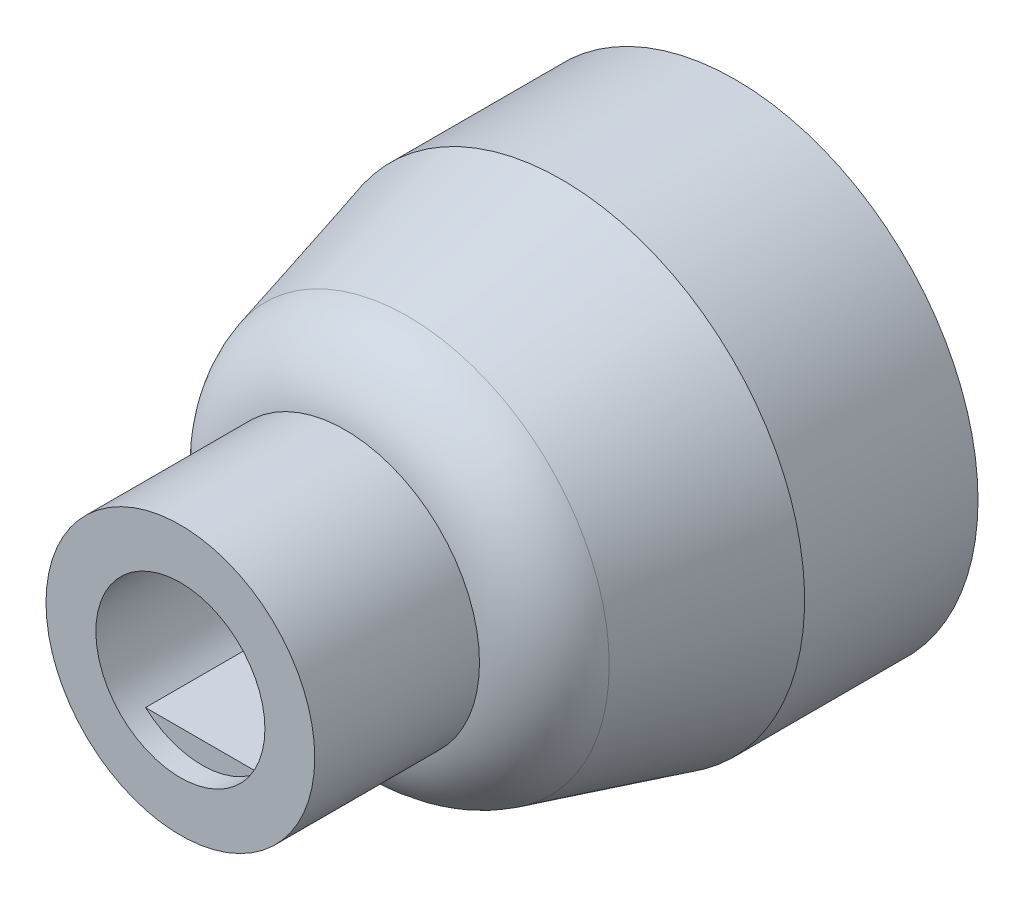
ISO-10303-21;
HEADER;
FILE_DESCRIPTION(('STEP AP214'),'2;1');
FILE_NAME('part.step','',(''),(''),'','','');
FILE_SCHEMA(('AUTOMOTIVE_DESIGN { 1 0 10303 214 1 1 1 1 }'));
ENDSEC;
DATA;
#1=APPLICATION_CONTEXT('core data for automotive mechanical design processes');
#2=APPLICATION_PROTOCOL_DEFINITION('international standard','automotive_design',2000,#1);
#3=PRODUCT_CONTEXT('',#1,'mechanical');
#4=PRODUCT('Part','Part','',(#3));
#5=PRODUCT_RELATED_PRODUCT_CATEGORY('part','',(#4));
#6=PRODUCT_DEFINITION_FORMATION('','',#4);
#7=PRODUCT_DEFINITION_CONTEXT('part definition',#1,'design');
#8=PRODUCT_DEFINITION('design','',#6,#7);
#9=PRODUCT_DEFINITION_SHAPE('','',#8);
#10=(LENGTH_UNIT() NAMED_UNIT(*) SI_UNIT(.MILLI.,.METRE.));
#11=(NAMED_UNIT(*) PLANE_ANGLE_UNIT() SI_UNIT($,.RADIAN.));
#12=(NAMED_UNIT(*) SI_UNIT($,.STERADIAN.) SOLID_ANGLE_UNIT());
#13=UNCERTAINTY_MEASURE_WITH_UNIT(LENGTH_MEASURE(1.E-05),#10,'distance_accuracy_value','');
#14=(GEOMETRIC_REPRESENTATION_CONTEXT(3) GLOBAL_UNCERTAINTY_ASSIGNED_CONTEXT((#13)) GLOBAL_UNIT_ASSIGNED_CONTEXT((#10,
#11,#12)) REPRESENTATION_CONTEXT('',''));
#15=CARTESIAN_POINT('',(0.,0.,0.));
#16=DIRECTION('',(0.,0.,1.));
#17=DIRECTION('',(1.,0.,0.));
#18=AXIS2_PLACEMENT_3D('',#15,#16,#17);
#19=CARTESIAN_POINT('',(-1.30384048104053,1.45,12.8));
#20=DIRECTION('',(0.,-1.,0.));
#21=DIRECTION('',(0.,0.,-1.));
#22=AXIS2_PLACEMENT_3D('',#19,#20,#21);
#23=PLANE('',#22);
#24=DIRECTION('',(0.,0.,-1.));
#25=VECTOR('',#24,1.);
#26=CARTESIAN_POINT('',(1.30384048104053,1.45,12.8));
#27=LINE('',#26,#25);
#28=CARTESIAN_POINT('',(1.30384048104053,1.45,12.3));
#29=VERTEX_POINT('',#28);
#30=CARTESIAN_POINT('',(1.30384048104053,1.45,9.));
#31=VERTEX_POINT('',#30);
#32=EDGE_CURVE('E90',#29,#31,#27,.T.);
#33=ORIENTED_EDGE('',*,*,#32,.F.);
#34=DIRECTION('',(-1.,0.,0.));
#35=VECTOR('',#34,1.);
#36=CARTESIAN_POINT('',(-1.30384048104053,1.45,12.3));
#37=LINE('',#36,#35);
#38=CARTESIAN_POINT('',(-1.30384048104053,1.45,12.3));
#39=VERTEX_POINT('',#38);
#40=EDGE_CURVE('E78',#29,#39,#37,.T.);
#41=ORIENTED_EDGE('',*,*,#40,.T.);
#42=DIRECTION('',(0.,0.,-1.));
#43=VECTOR('',#42,1.);
#44=CARTESIAN_POINT('',(-1.30384048104053,1.45,12.8));
#45=LINE('',#44,#43);
#46=CARTESIAN_POINT('',(-1.30384048104053,1.45,9.));
#47=VERTEX_POINT('',#46);
#48=EDGE_CURVE('E93',#39,#47,#45,.T.);
#49=ORIENTED_EDGE('',*,*,#48,.T.);
#50=DIRECTION('',(-1.,0.,0.));
#51=VECTOR('',#50,1.);
#52=CARTESIAN_POINT('',(-1.30384048104053,1.45,9.));
#53=LINE('',#52,#51);
#54=EDGE_CURVE('E98',#31,#47,#53,.T.);
#55=ORIENTED_EDGE('',*,*,#54,.F.);
#56=EDGE_LOOP('',(#33,#41,#49,#55));
#57=FACE_BOUND('',#56,.T.);
#58=ADVANCED_FACE('F39',(#57),#23,.T.);
#59=CARTESIAN_POINT('',(-1.30384048104053,-1.45,12.8));
#60=DIRECTION('',(0.,1.,0.));
#61=DIRECTION('',(0.,0.,1.));
#62=AXIS2_PLACEMENT_3D('',#59,#60,#61);
#63=PLANE('',#62);
#64=DIRECTION('',(0.,0.,-1.));
#65=VECTOR('',#64,1.);
#66=CARTESIAN_POINT('',(-1.30384048104053,-1.45,12.8));
#67=LINE('',#66,#65);
#68=CARTESIAN_POINT('',(-1.30384048104053,-1.45,12.3));
#69=VERTEX_POINT('',#68);
#70=CARTESIAN_POINT('',(-1.30384048104053,-1.45,9.));
#71=VERTEX_POINT('',#70);
#72=EDGE_CURVE('E107',#69,#71,#67,.T.);
#73=ORIENTED_EDGE('',*,*,#72,.F.);
#74=DIRECTION('',(1.,0.,0.));
#75=VECTOR('',#74,1.);
#76=CARTESIAN_POINT('',(-1.30384048104053,-1.45,12.3));
#77=LINE('',#76,#75);
#78=CARTESIAN_POINT('',(1.30384048104053,-1.45,12.3));
#79=VERTEX_POINT('',#78);
#80=EDGE_CURVE('E118',#69,#79,#77,.T.);
#81=ORIENTED_EDGE('',*,*,#80,.T.);
#82=DIRECTION('',(0.,0.,-1.));
#83=VECTOR('',#82,1.);
#84=CARTESIAN_POINT('',(1.30384048104053,-1.45,12.8));
#85=LINE('',#84,#83);
#86=CARTESIAN_POINT('',(1.30384048104053,-1.45,9.));
#87=VERTEX_POINT('',#86);
#88=EDGE_CURVE('E258',#79,#87,#85,.T.);
#89=ORIENTED_EDGE('',*,*,#88,.T.);
#90=DIRECTION('',(1.,0.,0.));
#91=VECTOR('',#90,1.);
#92=CARTESIAN_POINT('',(-1.30384048104053,-1.45,9.));
#93=LINE('',#92,#91);
#94=EDGE_CURVE('E244',#71,#87,#93,.T.);
#95=ORIENTED_EDGE('',*,*,#94,.F.);
#96=EDGE_LOOP('',(#73,#81,#89,#95));
#97=FACE_BOUND('',#96,.T.);
#98=ADVANCED_FACE('F139',(#97),#63,.T.);
#99=CARTESIAN_POINT('',(0.,0.,9.));
#100=DIRECTION('',(0.,0.,-1.));
#101=DIRECTION('',(-1.,0.,0.));
#102=AXIS2_PLACEMENT_3D('',#99,#100,#101);
#103=CYLINDRICAL_SURFACE('',#102,5.6);
#104=CARTESIAN_POINT('',(0.,0.,3.99999999999991));
#105=DIRECTION('',(0.,0.,1.));
#106=DIRECTION('',(1.,0.,0.));
#107=AXIS2_PLACEMENT_3D('',#104,#105,#106);
#108=CIRCLE('',#107,5.6);
#109=CARTESIAN_POINT('',(-5.6,0.,3.99999999999991));
#110=VERTEX_POINT('',#109);
#111=EDGE_CURVE('E48',#110,#110,#108,.F.);
#112=ORIENTED_EDGE('',*,*,#111,.T.);
#113=EDGE_LOOP('',(#112));
#114=FACE_BOUND('',#113,.T.);
#115=CARTESIAN_POINT('',(0.,0.,0.));
#116=DIRECTION('',(0.,0.,1.));
#117=DIRECTION('',(1.,0.,0.));
#118=AXIS2_PLACEMENT_3D('',#115,#116,#117);
#119=CIRCLE('',#118,5.6);
#120=CARTESIAN_POINT('',(5.6,0.,0.));
#121=VERTEX_POINT('',#120);
#122=EDGE_CURVE('E113',#121,#121,#119,.T.);
#123=ORIENTED_EDGE('',*,*,#122,.T.);
#124=EDGE_LOOP('',(#123));
#125=FACE_BOUND('',#124,.T.);
#126=ADVANCED_FACE('F124',(#114,#125),#103,.T.);
#127=CARTESIAN_POINT('',(0.,0.,0.));
#128=DIRECTION('',(0.,0.,1.));
#129=DIRECTION('',(1.,0.,0.));
#130=AXIS2_PLACEMENT_3D('',#127,#128,#129);
#131=PLANE('',#130);
#132=ORIENTED_EDGE('',*,*,#122,.F.);
#133=EDGE_LOOP('',(#132));
#134=FACE_BOUND('',#133,.T.);
#135=ADVANCED_FACE('F154',(#134),#131,.F.);
#136=CARTESIAN_POINT('',(0.,0.,12.8));
#137=DIRECTION('',(0.,0.,1.));
#138=DIRECTION('',(1.,0.,0.));
#139=AXIS2_PLACEMENT_3D('',#136,#137,#138);
#140=PLANE('',#139);
#141=CARTESIAN_POINT('',(0.,0.,12.8));
#142=DIRECTION('',(0.,0.,1.));
#143=DIRECTION('',(1.,0.,0.));
#144=AXIS2_PLACEMENT_3D('',#141,#142,#143);
#145=CIRCLE('',#144,1.95);
#146=CARTESIAN_POINT('',(1.95,0.,12.8));
#147=VERTEX_POINT('',#146);
#148=EDGE_CURVE('E252',#147,#147,#145,.T.);
#149=ORIENTED_EDGE('',*,*,#148,.F.);
#150=EDGE_LOOP('',(#149));
#151=FACE_BOUND('',#150,.T.);
#152=CARTESIAN_POINT('',(0.,0.,12.8));
#153=DIRECTION('',(0.,0.,1.));
#154=DIRECTION('',(1.,0.,0.));
#155=AXIS2_PLACEMENT_3D('',#152,#153,#154);
#156=CIRCLE('',#155,3.1);
#157=CARTESIAN_POINT('',(-3.1,0.,12.8));
#158=VERTEX_POINT('',#157);
#159=EDGE_CURVE('E105',#158,#158,#156,.T.);
#160=ORIENTED_EDGE('',*,*,#159,.T.);
#161=EDGE_LOOP('',(#160));
#162=FACE_BOUND('',#161,.T.);
#163=ADVANCED_FACE('F151',(#151,#162),#140,.T.);
#164=CARTESIAN_POINT('',(0.,0.,12.8));
#165=DIRECTION('',(0.,0.,-1.));
#166=DIRECTION('',(-1.,0.,0.));
#167=AXIS2_PLACEMENT_3D('',#164,#165,#166);
#168=CYLINDRICAL_SURFACE('',#167,3.1);
#169=CARTESIAN_POINT('',(0.,0.,9.));
#170=DIRECTION('',(0.,0.,1.));
#171=DIRECTION('',(1.,0.,0.));
#172=AXIS2_PLACEMENT_3D('',#169,#170,#171);
#173=CIRCLE('',#172,3.1);
#174=CARTESIAN_POINT('',(-3.1,0.,9.));
#175=VERTEX_POINT('',#174);
#176=EDGE_CURVE('E100',#175,#175,#173,.T.);
#177=CARTESIAN_POINT('',(-3.1,0.,12.8));
#178=CARTESIAN_POINT('',(-3.1,0.,12.7604166666667));
#179=CARTESIAN_POINT('',(-3.1,0.,12.7208333333333));
#180=CARTESIAN_POINT('',(-3.1,0.,12.6416666666667));
#181=CARTESIAN_POINT('',(-3.1,0.,12.6020833333333));
#182=CARTESIAN_POINT('',(-3.1,0.,12.5229166666667));
#183=CARTESIAN_POINT('',(-3.1,0.,12.4833333333333));
#184=CARTESIAN_POINT('',(-3.1,0.,12.4041666666667));
#185=CARTESIAN_POINT('',(-3.1,0.,12.3645833333333));
#186=CARTESIAN_POINT('',(-3.1,0.,12.2854166666667));
#187=CARTESIAN_POINT('',(-3.1,0.,12.2458333333333));
#188=CARTESIAN_POINT('',(-3.1,0.,12.1666666666667));
#189=CARTESIAN_POINT('',(-3.1,0.,12.1270833333333));
#190=CARTESIAN_POINT('',(-3.1,0.,12.0479166666667));
#191=CARTESIAN_POINT('',(-3.1,0.,12.0083333333333));
#192=CARTESIAN_POINT('',(-3.1,0.,11.9291666666667));
#193=CARTESIAN_POINT('',(-3.1,0.,11.8895833333333));
#194=CARTESIAN_POINT('',(-3.1,0.,11.8104166666667));
#195=CARTESIAN_POINT('',(-3.1,0.,11.7708333333333));
#196=CARTESIAN_POINT('',(-3.1,0.,11.6916666666667));
#197=CARTESIAN_POINT('',(-3.1,0.,11.6520833333333));
#198=CARTESIAN_POINT('',(-3.1,0.,11.5729166666667));
#199=CARTESIAN_POINT('',(-3.1,0.,11.5333333333333));
#200=CARTESIAN_POINT('',(-3.1,0.,11.4541666666667));
#201=CARTESIAN_POINT('',(-3.1,0.,11.4145833333333));
#202=CARTESIAN_POINT('',(-3.1,0.,11.3354166666667));
#203=CARTESIAN_POINT('',(-3.1,0.,11.2958333333333));
#204=CARTESIAN_POINT('',(-3.1,0.,11.2166666666667));
#205=CARTESIAN_POINT('',(-3.1,0.,11.1770833333333));
#206=CARTESIAN_POINT('',(-3.1,0.,11.0979166666667));
#207=CARTESIAN_POINT('',(-3.1,0.,11.0583333333333));
#208=CARTESIAN_POINT('',(-3.1,0.,10.9791666666667));
#209=CARTESIAN_POINT('',(-3.1,0.,10.9395833333333));
#210=CARTESIAN_POINT('',(-3.1,0.,10.8604166666667));
#211=CARTESIAN_POINT('',(-3.1,0.,10.8208333333333));
#212=CARTESIAN_POINT('',(-3.1,0.,10.7416666666667));
#213=CARTESIAN_POINT('',(-3.1,0.,10.7020833333333));
#214=CARTESIAN_POINT('',(-3.1,0.,10.6229166666667));
#215=CARTESIAN_POINT('',(-3.1,0.,10.5833333333333));
#216=CARTESIAN_POINT('',(-3.1,0.,10.5041666666667));
#217=CARTESIAN_POINT('',(-3.1,0.,10.4645833333333));
#218=CARTESIAN_POINT('',(-3.1,0.,10.3854166666667));
#219=CARTESIAN_POINT('',(-3.1,0.,10.3458333333333));
#220=CARTESIAN_POINT('',(-3.1,0.,10.2666666666667));
#221=CARTESIAN_POINT('',(-3.1,0.,10.2270833333333));
#222=CARTESIAN_POINT('',(-3.1,0.,10.1479166666667));
#223=CARTESIAN_POINT('',(-3.1,0.,10.1083333333333));
#224=CARTESIAN_POINT('',(-3.1,0.,10.0291666666667));
#225=CARTESIAN_POINT('',(-3.1,0.,9.98958333333333));
#226=CARTESIAN_POINT('',(-3.1,0.,9.91041666666667));
#227=CARTESIAN_POINT('',(-3.1,0.,9.87083333333333));
#228=CARTESIAN_POINT('',(-3.1,0.,9.79166666666667));
#229=CARTESIAN_POINT('',(-3.1,0.,9.75208333333333));
#230=CARTESIAN_POINT('',(-3.1,0.,9.67291666666666));
#231=CARTESIAN_POINT('',(-3.1,0.,9.63333333333333));
#232=CARTESIAN_POINT('',(-3.1,0.,9.55416666666667));
#233=CARTESIAN_POINT('',(-3.1,0.,9.51458333333333));
#234=CARTESIAN_POINT('',(-3.1,0.,9.43541666666667));
#235=CARTESIAN_POINT('',(-3.1,0.,9.39583333333333));
#236=CARTESIAN_POINT('',(-3.1,0.,9.31666666666667));
#237=CARTESIAN_POINT('',(-3.1,0.,9.27708333333333));
#238=CARTESIAN_POINT('',(-3.1,0.,9.19791666666666));
#239=CARTESIAN_POINT('',(-3.1,0.,9.15833333333333));
#240=CARTESIAN_POINT('',(-3.1,0.,9.07916666666667));
#241=CARTESIAN_POINT('',(-3.1,0.,9.03958333333333));
#242=CARTESIAN_POINT('',(-3.1,0.,9.));
#243=B_SPLINE_CURVE_WITH_KNOTS('',3,(#177,#178,#179,#180,#181,#182,#183,#184,#185,#186,#187,
#188,#189,#190,#191,#192,#193,#194,#195,#196,#197,#198,#199,#200,#201,#202,#203,#204,#205,#206,
#207,#208,#209,#210,#211,#212,#213,#214,#215,#216,#217,#218,#219,#220,#221,#222,#223,#224,#225,
#226,#227,#228,#229,#230,#231,#232,#233,#234,#235,#236,#237,#238,#239,#240,#241,#242),
.UNSPECIFIED.,.F.,.F.,(4,2,2,2,2,2,2,2,2,2,2,2,2,2,2,2,2,2,2,2,2,2,2,2,2,2,2,2,2,2,2,2,4),(0.,
0.118749999999999,0.2375,0.356249999999999,0.475,0.593749999999999,0.7125,0.831249999999999,
0.95,1.06875,1.1875,1.30625,1.425,1.54375,1.6625,1.78125,1.9,2.01875,2.1375,2.25625,2.375,
2.49375,2.6125,2.73125,2.85,2.96875,3.0875,3.20625,3.325,3.44375,3.5625,3.68125,3.8),.UNSPECIFIED.);
#244=EDGE_CURVE('BSEAM150',#158,#175,#243,.T.);
#245=ORIENTED_EDGE('',*,*,#159,.F.);
#246=ORIENTED_EDGE('',*,*,#176,.T.);
#247=ORIENTED_EDGE('',*,*,#244,.T.);
#248=ORIENTED_EDGE('',*,*,#244,.F.);
#249=EDGE_LOOP('',(#245,#247,#246,#248));
#250=FACE_BOUND('',#249,.T.);
#251=ADVANCED_FACE('F150',(#250),#168,.T.);
#252=CARTESIAN_POINT('',(0.,0.,12.8));
#253=DIRECTION('',(0.,0.,-1.));
#254=DIRECTION('',(-1.,0.,0.));
#255=AXIS2_PLACEMENT_3D('',#252,#253,#254);
#256=CYLINDRICAL_SURFACE('',#255,1.95);
#257=CARTESIAN_POINT('',(0.,0.,12.3));
#258=DIRECTION('',(0.,0.,1.));
#259=DIRECTION('',(1.,0.,0.));
#260=AXIS2_PLACEMENT_3D('',#257,#258,#259);
#261=CIRCLE('',#260,1.95);
#262=EDGE_CURVE('E54',#29,#39,#261,.T.);
#263=ORIENTED_EDGE('',*,*,#262,.F.);
#264=ORIENTED_EDGE('',*,*,#32,.T.);
#265=CARTESIAN_POINT('',(0.,0.,9.));
#266=DIRECTION('',(0.,0.,1.));
#267=DIRECTION('',(1.,0.,0.));
#268=AXIS2_PLACEMENT_3D('',#265,#266,#267);
#269=CIRCLE('',#268,1.95);
#270=EDGE_CURVE('E84',#87,#31,#269,.T.);
#271=ORIENTED_EDGE('',*,*,#270,.F.);
#272=ORIENTED_EDGE('',*,*,#88,.F.);
#273=EDGE_CURVE('E61',#69,#79,#261,.T.);
#274=ORIENTED_EDGE('',*,*,#273,.F.);
#275=ORIENTED_EDGE('',*,*,#72,.T.);
#276=CARTESIAN_POINT('',(0.,0.,9.));
#277=DIRECTION('',(0.,0.,1.));
#278=DIRECTION('',(1.,0.,0.));
#279=AXIS2_PLACEMENT_3D('',#276,#277,#278);
#280=CIRCLE('',#279,1.95);
#281=EDGE_CURVE('E249',#47,#71,#280,.T.);
#282=ORIENTED_EDGE('',*,*,#281,.F.);
#283=ORIENTED_EDGE('',*,*,#48,.F.);
#284=EDGE_LOOP('',(#263,#264,#271,#272,#274,#275,#282,#283));
#285=FACE_BOUND('',#284,.T.);
#286=ORIENTED_EDGE('',*,*,#148,.T.);
#287=EDGE_LOOP('',(#286));
#288=FACE_BOUND('',#287,.T.);
#289=ADVANCED_FACE('F87',(#285,#288),#256,.F.);
#290=CARTESIAN_POINT('',(0.,0.,9.));
#291=DIRECTION('',(0.,0.,1.));
#292=DIRECTION('',(1.,0.,0.));
#293=AXIS2_PLACEMENT_3D('',#290,#291,#292);
#294=PLANE('',#293);
#295=ORIENTED_EDGE('',*,*,#270,.T.);
#296=ORIENTED_EDGE('',*,*,#54,.T.);
#297=ORIENTED_EDGE('',*,*,#281,.T.);
#298=ORIENTED_EDGE('',*,*,#94,.T.);
#299=EDGE_LOOP('',(#295,#296,#297,#298));
#300=FACE_BOUND('',#299,.T.);
#301=ADVANCED_FACE('F149',(#300),#294,.T.);
#302=CARTESIAN_POINT('',(0.,0.,12.3));
#303=DIRECTION('',(0.,0.,1.));
#304=DIRECTION('',(1.,0.,0.));
#305=AXIS2_PLACEMENT_3D('',#302,#303,#304);
#306=PLANE('',#305);
#307=ORIENTED_EDGE('',*,*,#273,.T.);
#308=ORIENTED_EDGE('',*,*,#80,.F.);
#309=EDGE_LOOP('',(#307,#308));
#310=FACE_BOUND('',#309,.T.);
#311=ADVANCED_FACE('F135',(#310),#306,.T.);
#312=ORIENTED_EDGE('',*,*,#262,.T.);
#313=ORIENTED_EDGE('',*,*,#40,.F.);
#314=EDGE_LOOP('',(#312,#313));
#315=FACE_BOUND('',#314,.T.);
#316=ADVANCED_FACE('F79',(#315),#306,.T.);
#317=CARTESIAN_POINT('',(0.,0.,9.));
#318=DIRECTION('',(0.,0.,-1.));
#319=DIRECTION('',(-1.,0.,0.));
#320=AXIS2_PLACEMENT_3D('',#317,#318,#319);
#321=CONICAL_SURFACE('',#320,4.26025403784438,0.261799387799147);
#322=CARTESIAN_POINT('',(0.,0.,7.55492474881714));
#323=DIRECTION('',(0.,0.,-1.));
#324=DIRECTION('',(-1.,0.,0.));
#325=AXIS2_PLACEMENT_3D('',#322,#323,#324);
#326=CIRCLE('',#325,4.64746078440102);
#327=CARTESIAN_POINT('',(-4.64746078440102,0.,7.55492474881714));
#328=VERTEX_POINT('',#327);
#329=EDGE_CURVE('E11',#328,#328,#326,.T.);
#330=CARTESIAN_POINT('',(-4.64746078440102,0.,7.55492474881714));
#331=CARTESIAN_POINT('',(-4.65738306789685,0.,7.51789428268362));
#332=CARTESIAN_POINT('',(-4.66730535139267,0.,7.48086381655011));
#333=CARTESIAN_POINT('',(-4.68714991838431,0.,7.40680288428308));
#334=CARTESIAN_POINT('',(-4.69707220188014,0.,7.36977241814957));
#335=CARTESIAN_POINT('',(-4.71691676887178,0.,7.29571148588255));
#336=CARTESIAN_POINT('',(-4.72683905236761,0.,7.25868101974903));
#337=CARTESIAN_POINT('',(-4.74668361935925,0.,7.18462008748201));
#338=CARTESIAN_POINT('',(-4.75660590285507,0.,7.1475896213485));
#339=CARTESIAN_POINT('',(-4.77645046984672,0.,7.07352868908147));
#340=CARTESIAN_POINT('',(-4.78637275334254,0.,7.03649822294796));
#341=CARTESIAN_POINT('',(-4.80621732033419,0.,6.96243729068093));
#342=CARTESIAN_POINT('',(-4.81613960383001,0.,6.92540682454742));
#343=CARTESIAN_POINT('',(-4.83598417082165,0.,6.85134589228039));
#344=CARTESIAN_POINT('',(-4.84590645431748,0.,6.81431542614688));
#345=CARTESIAN_POINT('',(-4.86575102130912,0.,6.74025449387986));
#346=CARTESIAN_POINT('',(-4.87567330480495,0.,6.70322402774634));
#347=CARTESIAN_POINT('',(-4.89551787179659,0.,6.62916309547932));
#348=CARTESIAN_POINT('',(-4.90544015529241,0.,6.5921326293458));
#349=CARTESIAN_POINT('',(-4.92528472228406,0.,6.51807169707878));
#350=CARTESIAN_POINT('',(-4.93520700577988,0.,6.48104123094527));
#351=CARTESIAN_POINT('',(-4.95505157277153,0.,6.40698029867824));
#352=CARTESIAN_POINT('',(-4.96497385626735,0.,6.36994983254473));
#353=CARTESIAN_POINT('',(-4.98481842325899,0.,6.2958889002777));
#354=CARTESIAN_POINT('',(-4.99474070675482,0.,6.25885843414419));
#355=CARTESIAN_POINT('',(-5.01458527374646,0.,6.18479750187716));
#356=CARTESIAN_POINT('',(-5.02450755724229,0.,6.14776703574365));
#357=CARTESIAN_POINT('',(-5.04435212423393,0.,6.07370610347663));
#358=CARTESIAN_POINT('',(-5.05427440772975,0.,6.03667563734311));
#359=CARTESIAN_POINT('',(-5.0741189747214,0.,5.96261470507609));
#360=CARTESIAN_POINT('',(-5.08404125821722,0.,5.92558423894258));
#361=CARTESIAN_POINT('',(-5.10388582520887,0.,5.85152330667555));
#362=CARTESIAN_POINT('',(-5.11380810870469,0.,5.81449284054204));
#363=CARTESIAN_POINT('',(-5.13365267569634,0.,5.74043190827501));
#364=CARTESIAN_POINT('',(-5.14357495919216,0.,5.7034014421415));
#365=CARTESIAN_POINT('',(-5.1634195261838,0.,5.62934050987447));
#366=CARTESIAN_POINT('',(-5.17334180967963,0.,5.59231004374096));
#367=CARTESIAN_POINT('',(-5.19318637667127,0.,5.51824911147393));
#368=CARTESIAN_POINT('',(-5.20310866016709,0.,5.48121864534042));
#369=CARTESIAN_POINT('',(-5.22295322715874,0.,5.4071577130734));
#370=CARTESIAN_POINT('',(-5.23287551065456,0.,5.37012724693988));
#371=CARTESIAN_POINT('',(-5.25272007764621,0.,5.29606631467286));
#372=CARTESIAN_POINT('',(-5.26264236114203,0.,5.25903584853935));
#373=CARTESIAN_POINT('',(-5.28248692813368,0.,5.18497491627232));
#374=CARTESIAN_POINT('',(-5.2924092116295,0.,5.14794445013881));
#375=CARTESIAN_POINT('',(-5.31225377862114,0.,5.07388351787178));
#376=CARTESIAN_POINT('',(-5.32217606211697,0.,5.03685305173827));
#377=CARTESIAN_POINT('',(-5.34202062910861,0.,4.96279211947124));
#378=CARTESIAN_POINT('',(-5.35194291260443,0.,4.92576165333773));
#379=CARTESIAN_POINT('',(-5.37178747959608,0.,4.85170072107071));
#380=CARTESIAN_POINT('',(-5.3817097630919,0.,4.81467025493719));
#381=CARTESIAN_POINT('',(-5.40155433008355,0.,4.74060932267017));
#382=CARTESIAN_POINT('',(-5.41147661357937,0.,4.70357885653666));
#383=CARTESIAN_POINT('',(-5.43132118057101,0.,4.62951792426963));
#384=CARTESIAN_POINT('',(-5.44124346406684,0.,4.59248745813612));
#385=CARTESIAN_POINT('',(-5.46108803105848,0.,4.51842652586909));
#386=CARTESIAN_POINT('',(-5.47101031455431,0.,4.48139605973558));
#387=CARTESIAN_POINT('',(-5.49085488154595,0.,4.40733512746855));
#388=CARTESIAN_POINT('',(-5.50077716504177,0.,4.37030466133504));
#389=CARTESIAN_POINT('',(-5.52062173203342,0.,4.29624372906802));
#390=CARTESIAN_POINT('',(-5.53054401552924,0.,4.2592132629345));
#391=CARTESIAN_POINT('',(-5.55038858252089,0.,4.18515233066748));
#392=CARTESIAN_POINT('',(-5.56031086601671,0.,4.14812186453397));
#393=CARTESIAN_POINT('',(-5.58015543300836,0.,4.07406093226694));
#394=CARTESIAN_POINT('',(-5.59007771650418,0.,4.03703046613343));
#395=CARTESIAN_POINT('',(-5.6,0.,3.99999999999991));
#396=B_SPLINE_CURVE_WITH_KNOTS('',3,(#330,#331,#332,#333,#334,#335,#336,#337,#338,#339,#340,
#341,#342,#343,#344,#345,#346,#347,#348,#349,#350,#351,#352,#353,#354,#355,#356,#357,#358,#359,
#360,#361,#362,#363,#364,#365,#366,#367,#368,#369,#370,#371,#372,#373,#374,#375,#376,#377,#378,
#379,#380,#381,#382,#383,#384,#385,#386,#387,#388,#389,#390,#391,#392,#393,#394,#395),
.UNSPECIFIED.,.F.,.F.,(4,2,2,2,2,2,2,2,2,2,2,2,2,2,2,2,2,2,2,2,2,2,2,2,2,2,2,2,2,2,2,2,4),(0.,
0.115010278612524,0.230020557225047,0.345030835837571,0.460041114450095,0.575051393062619,
0.690061671675144,0.805071950287667,0.920082228900191,1.03509250751271,1.15010278612524,
1.26511306473776,1.38012334335029,1.49513362196281,1.61014390057533,1.72515417918786,
1.84016445780038,1.95517473641291,2.07018501502543,2.18519529363795,2.30020557225048,
2.415215850863,2.53022612947553,2.64523640808805,2.76024668670057,2.8752569653131,
2.99026724392562,3.10527752253814,3.22028780115067,3.33529807976319,3.45030835837572,
3.56531863698824,3.68032891560076),.UNSPECIFIED.);
#397=EDGE_CURVE('BSEAM127',#328,#110,#396,.T.);
#398=ORIENTED_EDGE('',*,*,#329,.T.);
#399=ORIENTED_EDGE('',*,*,#111,.F.);
#400=ORIENTED_EDGE('',*,*,#397,.T.);
#401=ORIENTED_EDGE('',*,*,#397,.F.);
#402=EDGE_LOOP('',(#398,#400,#399,#401));
#403=FACE_BOUND('',#402,.T.);
#404=ADVANCED_FACE('F127',(#403),#321,.T.);
#405=CARTESIAN_POINT('',(0.,0.,7.0372866586121));
#406=DIRECTION('',(0.,0.,1.));
#407=DIRECTION('',(1.,0.,0.));
#408=AXIS2_PLACEMENT_3D('',#405,#406,#407);
#409=TOROIDAL_SURFACE('',#408,2.71560913182289,2.);
#410=ORIENTED_EDGE('',*,*,#329,.F.);
#411=EDGE_LOOP('',(#410));
#412=FACE_BOUND('',#411,.T.);
#413=ORIENTED_EDGE('',*,*,#176,.F.);
#414=EDGE_LOOP('',(#413));
#415=FACE_BOUND('',#414,.T.);
#416=ADVANCED_FACE('F41',(#412,#415),#409,.T.);
#417=CLOSED_SHELL('',(#58,#98,#126,#135,#163,#251,#289,#301,#311,#316,#404,#416));
#418=MANIFOLD_SOLID_BREP('B2',#417);
#419=ADVANCED_BREP_SHAPE_REPRESENTATION('',(#18,#418),#14);
#420=SHAPE_DEFINITION_REPRESENTATION(#9,#419);
ENDSEC;
END-ISO-10303-21;
